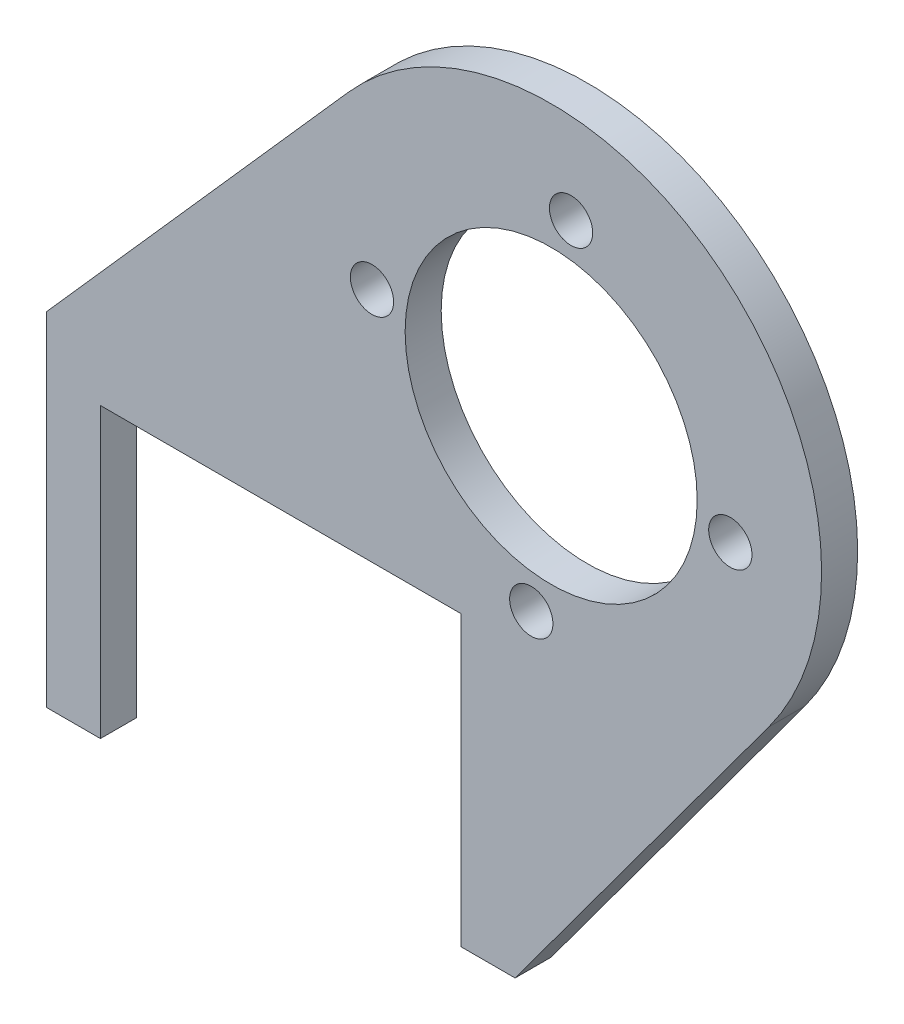
ISO-10303-21;
HEADER;
FILE_DESCRIPTION(('STEP AP214'),'2;1');
FILE_NAME('part.step','',(''),(''),'','','');
FILE_SCHEMA(('AUTOMOTIVE_DESIGN { 1 0 10303 214 1 1 1 1 }'));
ENDSEC;
DATA;
#1=APPLICATION_CONTEXT('core data for automotive mechanical design processes');
#2=APPLICATION_PROTOCOL_DEFINITION('international standard','automotive_design',2000,#1);
#3=PRODUCT_CONTEXT('',#1,'mechanical');
#4=PRODUCT('Part','Part','',(#3));
#5=PRODUCT_RELATED_PRODUCT_CATEGORY('part','',(#4));
#6=PRODUCT_DEFINITION_FORMATION('','',#4);
#7=PRODUCT_DEFINITION_CONTEXT('part definition',#1,'design');
#8=PRODUCT_DEFINITION('design','',#6,#7);
#9=PRODUCT_DEFINITION_SHAPE('','',#8);
#10=(LENGTH_UNIT() NAMED_UNIT(*) SI_UNIT(.MILLI.,.METRE.));
#11=(NAMED_UNIT(*) PLANE_ANGLE_UNIT() SI_UNIT($,.RADIAN.));
#12=(NAMED_UNIT(*) SI_UNIT($,.STERADIAN.) SOLID_ANGLE_UNIT());
#13=UNCERTAINTY_MEASURE_WITH_UNIT(LENGTH_MEASURE(1.E-05),#10,'distance_accuracy_value','');
#14=(GEOMETRIC_REPRESENTATION_CONTEXT(3) GLOBAL_UNCERTAINTY_ASSIGNED_CONTEXT((#13)) GLOBAL_UNIT_ASSIGNED_CONTEXT((#10,
#11,#12)) REPRESENTATION_CONTEXT('',''));
#15=CARTESIAN_POINT('',(0.,0.,0.));
#16=DIRECTION('',(0.,0.,1.));
#17=DIRECTION('',(1.,0.,0.));
#18=AXIS2_PLACEMENT_3D('',#15,#16,#17);
#19=CARTESIAN_POINT('',(0.,0.,10.));
#20=DIRECTION('',(0.,0.,-1.));
#21=DIRECTION('',(-1.,0.,0.));
#22=AXIS2_PLACEMENT_3D('',#19,#20,#21);
#23=PLANE('',#22);
#24=CARTESIAN_POINT('',(49.68668234486,-5.52074248276229,10.));
#25=DIRECTION('',(0.,0.,1.));
#26=DIRECTION('',(1.,0.,0.));
#27=AXIS2_PLACEMENT_3D('',#24,#25,#26);
#28=CIRCLE('',#27,5.99999999999999);
#29=CARTESIAN_POINT('',(55.68668234486,-5.52074248276229,10.));
#30=VERTEX_POINT('',#29);
#31=EDGE_CURVE('E212',#30,#30,#28,.T.);
#32=ORIENTED_EDGE('',*,*,#31,.F.);
#33=EDGE_LOOP('',(#32));
#34=FACE_BOUND('',#33,.T.);
#35=CARTESIAN_POINT('',(-49.68668234486,5.52074248276231,10.));
#36=DIRECTION('',(0.,0.,1.));
#37=DIRECTION('',(1.,0.,0.));
#38=AXIS2_PLACEMENT_3D('',#35,#36,#37);
#39=CIRCLE('',#38,5.99999999999999);
#40=CARTESIAN_POINT('',(-43.68668234486,5.52074248276231,10.));
#41=VERTEX_POINT('',#40);
#42=EDGE_CURVE('E200',#41,#41,#39,.T.);
#43=ORIENTED_EDGE('',*,*,#42,.F.);
#44=EDGE_LOOP('',(#43));
#45=FACE_BOUND('',#44,.T.);
#46=CARTESIAN_POINT('',(0.,0.,10.));
#47=DIRECTION('',(0.,0.,1.));
#48=DIRECTION('',(-1.,0.,0.));
#49=AXIS2_PLACEMENT_3D('',#46,#47,#48);
#50=CIRCLE('',#49,75.);
#51=CARTESIAN_POINT('',(60.3781778862432,-44.491298420446,10.));
#52=VERTEX_POINT('',#51);
#53=CARTESIAN_POINT('',(-56.1575715201263,49.7124447292818,10.));
#54=VERTEX_POINT('',#53);
#55=EDGE_CURVE('E155',#52,#54,#50,.T.);
#56=ORIENTED_EDGE('',*,*,#55,.T.);
#57=DIRECTION('',(-0.662832596390424,-0.748767620268351,0.));
#58=VECTOR('',#57,1.);
#59=CARTESIAN_POINT('',(-56.1575715201263,49.7124447292818,10.));
#60=LINE('',#59,#58);
#61=CARTESIAN_POINT('',(-140.,-45.0000000000001,10.));
#62=VERTEX_POINT('',#61);
#63=EDGE_CURVE('E98',#54,#62,#60,.T.);
#64=ORIENTED_EDGE('',*,*,#63,.T.);
#65=DIRECTION('',(0.,-1.,0.));
#66=VECTOR('',#65,1.);
#67=CARTESIAN_POINT('',(-140.,-45.0000000000001,10.));
#68=LINE('',#67,#66);
#69=CARTESIAN_POINT('',(-140.,-140.,10.));
#70=VERTEX_POINT('',#69);
#71=EDGE_CURVE('E173',#62,#70,#68,.T.);
#72=ORIENTED_EDGE('',*,*,#71,.T.);
#73=DIRECTION('',(1.,0.,0.));
#74=VECTOR('',#73,1.);
#75=CARTESIAN_POINT('',(-140.,-140.,10.));
#76=LINE('',#75,#74);
#77=CARTESIAN_POINT('',(-125.,-140.,10.));
#78=VERTEX_POINT('',#77);
#79=EDGE_CURVE('E190',#70,#78,#76,.T.);
#80=ORIENTED_EDGE('',*,*,#79,.T.);
#81=DIRECTION('',(0.,1.,0.));
#82=VECTOR('',#81,1.);
#83=CARTESIAN_POINT('',(-125.,-140.,10.));
#84=LINE('',#83,#82);
#85=CARTESIAN_POINT('',(-125.,-60.,10.));
#86=VERTEX_POINT('',#85);
#87=EDGE_CURVE('E189',#78,#86,#84,.T.);
#88=ORIENTED_EDGE('',*,*,#87,.T.);
#89=DIRECTION('',(1.,0.,0.));
#90=VECTOR('',#89,1.);
#91=CARTESIAN_POINT('',(-125.,-60.,10.));
#92=LINE('',#91,#90);
#93=CARTESIAN_POINT('',(-25.,-60.,10.));
#94=VERTEX_POINT('',#93);
#95=EDGE_CURVE('E120',#86,#94,#92,.T.);
#96=ORIENTED_EDGE('',*,*,#95,.T.);
#97=DIRECTION('',(0.,-1.,0.));
#98=VECTOR('',#97,1.);
#99=CARTESIAN_POINT('',(-25.,-60.,10.));
#100=LINE('',#99,#98);
#101=CARTESIAN_POINT('',(-25.,-140.,10.));
#102=VERTEX_POINT('',#101);
#103=EDGE_CURVE('E114',#94,#102,#100,.T.);
#104=ORIENTED_EDGE('',*,*,#103,.T.);
#105=DIRECTION('',(1.,0.,0.));
#106=VECTOR('',#105,1.);
#107=CARTESIAN_POINT('',(-25.,-140.,10.));
#108=LINE('',#107,#106);
#109=CARTESIAN_POINT('',(-9.99999999999995,-140.,10.));
#110=VERTEX_POINT('',#109);
#111=EDGE_CURVE('E118',#102,#110,#108,.T.);
#112=ORIENTED_EDGE('',*,*,#111,.T.);
#113=DIRECTION('',(0.593217312272613,0.805042371816575,0.));
#114=VECTOR('',#113,1.);
#115=CARTESIAN_POINT('',(-9.99999999999995,-140.,10.));
#116=LINE('',#115,#114);
#117=EDGE_CURVE('E52',#110,#52,#116,.T.);
#118=ORIENTED_EDGE('',*,*,#117,.T.);
#119=EDGE_LOOP('',(#56,#64,#72,#80,#88,#96,#104,#112,#118));
#120=FACE_BOUND('',#119,.T.);
#121=CARTESIAN_POINT('',(0.,0.,10.));
#122=DIRECTION('',(0.,0.,1.));
#123=DIRECTION('',(1.,0.,0.));
#124=AXIS2_PLACEMENT_3D('',#121,#122,#123);
#125=CIRCLE('',#124,40.5);
#126=CARTESIAN_POINT('',(40.5,0.,10.));
#127=VERTEX_POINT('',#126);
#128=EDGE_CURVE('E142',#127,#127,#125,.T.);
#129=ORIENTED_EDGE('',*,*,#128,.F.);
#130=EDGE_LOOP('',(#129));
#131=FACE_BOUND('',#130,.T.);
#132=CARTESIAN_POINT('',(5.52074248276232,49.68668234486,10.));
#133=DIRECTION('',(0.,0.,1.));
#134=DIRECTION('',(1.,0.,0.));
#135=AXIS2_PLACEMENT_3D('',#132,#133,#134);
#136=CIRCLE('',#135,6.);
#137=CARTESIAN_POINT('',(11.5207424827623,49.68668234486,10.));
#138=VERTEX_POINT('',#137);
#139=EDGE_CURVE('E206',#138,#138,#136,.T.);
#140=ORIENTED_EDGE('',*,*,#139,.F.);
#141=EDGE_LOOP('',(#140));
#142=FACE_BOUND('',#141,.T.);
#143=CARTESIAN_POINT('',(-5.52074248276231,-49.68668234486,10.));
#144=DIRECTION('',(0.,0.,1.));
#145=DIRECTION('',(1.,0.,0.));
#146=AXIS2_PLACEMENT_3D('',#143,#144,#145);
#147=CIRCLE('',#146,5.99999999999999);
#148=CARTESIAN_POINT('',(0.479257517237678,-49.68668234486,10.));
#149=VERTEX_POINT('',#148);
#150=EDGE_CURVE('E218',#149,#149,#147,.T.);
#151=ORIENTED_EDGE('',*,*,#150,.F.);
#152=EDGE_LOOP('',(#151));
#153=FACE_BOUND('',#152,.T.);
#154=ADVANCED_FACE('F35',(#34,#45,#120,#131,#142,#153),#23,.F.);
#155=CARTESIAN_POINT('',(0.,0.,0.));
#156=DIRECTION('',(0.,0.,-1.));
#157=DIRECTION('',(-1.,0.,0.));
#158=AXIS2_PLACEMENT_3D('',#155,#156,#157);
#159=PLANE('',#158);
#160=CARTESIAN_POINT('',(49.68668234486,-5.52074248276229,0.));
#161=DIRECTION('',(0.,0.,1.));
#162=DIRECTION('',(1.,0.,0.));
#163=AXIS2_PLACEMENT_3D('',#160,#161,#162);
#164=CIRCLE('',#163,5.99999999999999);
#165=CARTESIAN_POINT('',(55.68668234486,-5.52074248276229,0.));
#166=VERTEX_POINT('',#165);
#167=EDGE_CURVE('E215',#166,#166,#164,.T.);
#168=ORIENTED_EDGE('',*,*,#167,.T.);
#169=EDGE_LOOP('',(#168));
#170=FACE_BOUND('',#169,.T.);
#171=CARTESIAN_POINT('',(-49.68668234486,5.52074248276231,0.));
#172=DIRECTION('',(0.,0.,1.));
#173=DIRECTION('',(1.,0.,0.));
#174=AXIS2_PLACEMENT_3D('',#171,#172,#173);
#175=CIRCLE('',#174,5.99999999999999);
#176=CARTESIAN_POINT('',(-43.68668234486,5.52074248276231,0.));
#177=VERTEX_POINT('',#176);
#178=EDGE_CURVE('E203',#177,#177,#175,.T.);
#179=ORIENTED_EDGE('',*,*,#178,.T.);
#180=EDGE_LOOP('',(#179));
#181=FACE_BOUND('',#180,.T.);
#182=CARTESIAN_POINT('',(0.,0.,0.));
#183=DIRECTION('',(0.,0.,1.));
#184=DIRECTION('',(-1.,0.,0.));
#185=AXIS2_PLACEMENT_3D('',#182,#183,#184);
#186=CIRCLE('',#185,75.);
#187=CARTESIAN_POINT('',(60.3781778862432,-44.491298420446,0.));
#188=VERTEX_POINT('',#187);
#189=CARTESIAN_POINT('',(-56.1575715201263,49.7124447292818,0.));
#190=VERTEX_POINT('',#189);
#191=EDGE_CURVE('E138',#188,#190,#186,.T.);
#192=ORIENTED_EDGE('',*,*,#191,.F.);
#193=DIRECTION('',(0.593217312272613,0.805042371816575,0.));
#194=VECTOR('',#193,1.);
#195=CARTESIAN_POINT('',(-9.99999999999995,-140.,0.));
#196=LINE('',#195,#194);
#197=CARTESIAN_POINT('',(-9.99999999999995,-140.,0.));
#198=VERTEX_POINT('',#197);
#199=EDGE_CURVE('E90',#198,#188,#196,.T.);
#200=ORIENTED_EDGE('',*,*,#199,.F.);
#201=DIRECTION('',(1.,0.,0.));
#202=VECTOR('',#201,1.);
#203=CARTESIAN_POINT('',(-25.,-140.,0.));
#204=LINE('',#203,#202);
#205=CARTESIAN_POINT('',(-25.,-140.,0.));
#206=VERTEX_POINT('',#205);
#207=EDGE_CURVE('E84',#206,#198,#204,.T.);
#208=ORIENTED_EDGE('',*,*,#207,.F.);
#209=DIRECTION('',(0.,-1.,0.));
#210=VECTOR('',#209,1.);
#211=CARTESIAN_POINT('',(-25.,-60.,0.));
#212=LINE('',#211,#210);
#213=CARTESIAN_POINT('',(-25.,-60.,0.));
#214=VERTEX_POINT('',#213);
#215=EDGE_CURVE('E128',#214,#206,#212,.T.);
#216=ORIENTED_EDGE('',*,*,#215,.F.);
#217=DIRECTION('',(1.,0.,0.));
#218=VECTOR('',#217,1.);
#219=CARTESIAN_POINT('',(-125.,-60.,0.));
#220=LINE('',#219,#218);
#221=CARTESIAN_POINT('',(-125.,-60.,0.));
#222=VERTEX_POINT('',#221);
#223=EDGE_CURVE('E150',#222,#214,#220,.T.);
#224=ORIENTED_EDGE('',*,*,#223,.F.);
#225=DIRECTION('',(0.,1.,0.));
#226=VECTOR('',#225,1.);
#227=CARTESIAN_POINT('',(-125.,-140.,0.));
#228=LINE('',#227,#226);
#229=CARTESIAN_POINT('',(-125.,-140.,0.));
#230=VERTEX_POINT('',#229);
#231=EDGE_CURVE('E148',#230,#222,#228,.T.);
#232=ORIENTED_EDGE('',*,*,#231,.F.);
#233=DIRECTION('',(1.,0.,0.));
#234=VECTOR('',#233,1.);
#235=CARTESIAN_POINT('',(-140.,-140.,0.));
#236=LINE('',#235,#234);
#237=CARTESIAN_POINT('',(-140.,-140.,0.));
#238=VERTEX_POINT('',#237);
#239=EDGE_CURVE('E146',#238,#230,#236,.T.);
#240=ORIENTED_EDGE('',*,*,#239,.F.);
#241=DIRECTION('',(0.,-1.,0.));
#242=VECTOR('',#241,1.);
#243=CARTESIAN_POINT('',(-140.,-45.0000000000001,0.));
#244=LINE('',#243,#242);
#245=CARTESIAN_POINT('',(-140.,-45.0000000000001,0.));
#246=VERTEX_POINT('',#245);
#247=EDGE_CURVE('E144',#246,#238,#244,.T.);
#248=ORIENTED_EDGE('',*,*,#247,.F.);
#249=DIRECTION('',(-0.662832596390424,-0.748767620268351,0.));
#250=VECTOR('',#249,1.);
#251=CARTESIAN_POINT('',(-56.1575715201263,49.7124447292818,0.));
#252=LINE('',#251,#250);
#253=EDGE_CURVE('E141',#190,#246,#252,.T.);
#254=ORIENTED_EDGE('',*,*,#253,.F.);
#255=EDGE_LOOP('',(#192,#200,#208,#216,#224,#232,#240,#248,#254));
#256=FACE_BOUND('',#255,.T.);
#257=CARTESIAN_POINT('',(0.,0.,0.));
#258=DIRECTION('',(0.,0.,1.));
#259=DIRECTION('',(1.,0.,0.));
#260=AXIS2_PLACEMENT_3D('',#257,#258,#259);
#261=CIRCLE('',#260,40.5);
#262=CARTESIAN_POINT('',(40.5,0.,0.));
#263=VERTEX_POINT('',#262);
#264=EDGE_CURVE('E197',#263,#263,#261,.T.);
#265=ORIENTED_EDGE('',*,*,#264,.T.);
#266=EDGE_LOOP('',(#265));
#267=FACE_BOUND('',#266,.T.);
#268=CARTESIAN_POINT('',(5.52074248276232,49.68668234486,0.));
#269=DIRECTION('',(0.,0.,1.));
#270=DIRECTION('',(1.,0.,0.));
#271=AXIS2_PLACEMENT_3D('',#268,#269,#270);
#272=CIRCLE('',#271,6.);
#273=CARTESIAN_POINT('',(11.5207424827623,49.68668234486,0.));
#274=VERTEX_POINT('',#273);
#275=EDGE_CURVE('E209',#274,#274,#272,.T.);
#276=ORIENTED_EDGE('',*,*,#275,.T.);
#277=EDGE_LOOP('',(#276));
#278=FACE_BOUND('',#277,.T.);
#279=CARTESIAN_POINT('',(-5.52074248276231,-49.68668234486,0.));
#280=DIRECTION('',(0.,0.,1.));
#281=DIRECTION('',(1.,0.,0.));
#282=AXIS2_PLACEMENT_3D('',#279,#280,#281);
#283=CIRCLE('',#282,5.99999999999999);
#284=CARTESIAN_POINT('',(0.479257517237678,-49.68668234486,0.));
#285=VERTEX_POINT('',#284);
#286=EDGE_CURVE('E221',#285,#285,#283,.T.);
#287=ORIENTED_EDGE('',*,*,#286,.T.);
#288=EDGE_LOOP('',(#287));
#289=FACE_BOUND('',#288,.T.);
#290=ADVANCED_FACE('F177',(#170,#181,#256,#267,#278,#289),#159,.T.);
#291=CARTESIAN_POINT('',(0.,0.,10.));
#292=DIRECTION('',(0.,0.,-1.));
#293=DIRECTION('',(-1.,0.,0.));
#294=AXIS2_PLACEMENT_3D('',#291,#292,#293);
#295=CYLINDRICAL_SURFACE('',#294,75.);
#296=ORIENTED_EDGE('',*,*,#191,.T.);
#297=DIRECTION('',(0.,0.,-1.));
#298=VECTOR('',#297,1.);
#299=CARTESIAN_POINT('',(-56.1575715201263,49.7124447292818,10.));
#300=LINE('',#299,#298);
#301=EDGE_CURVE('E11',#54,#190,#300,.T.);
#302=ORIENTED_EDGE('',*,*,#301,.F.);
#303=ORIENTED_EDGE('',*,*,#55,.F.);
#304=DIRECTION('',(0.,0.,-1.));
#305=VECTOR('',#304,1.);
#306=CARTESIAN_POINT('',(60.3781778862432,-44.491298420446,10.));
#307=LINE('',#306,#305);
#308=EDGE_CURVE('E134',#52,#188,#307,.T.);
#309=ORIENTED_EDGE('',*,*,#308,.T.);
#310=EDGE_LOOP('',(#296,#302,#303,#309));
#311=FACE_BOUND('',#310,.T.);
#312=ADVANCED_FACE('F37',(#311),#295,.T.);
#313=CARTESIAN_POINT('',(-56.1575715201263,49.7124447292818,10.));
#314=DIRECTION('',(0.748767620268351,-0.662832596390424,0.));
#315=DIRECTION('',(0.662832596390424,0.748767620268351,0.));
#316=AXIS2_PLACEMENT_3D('',#313,#314,#315);
#317=PLANE('',#316);
#318=ORIENTED_EDGE('',*,*,#253,.T.);
#319=DIRECTION('',(0.,0.,-1.));
#320=VECTOR('',#319,1.);
#321=CARTESIAN_POINT('',(-140.,-45.0000000000001,10.));
#322=LINE('',#321,#320);
#323=EDGE_CURVE('E44',#62,#246,#322,.T.);
#324=ORIENTED_EDGE('',*,*,#323,.F.);
#325=ORIENTED_EDGE('',*,*,#63,.F.);
#326=ORIENTED_EDGE('',*,*,#301,.T.);
#327=EDGE_LOOP('',(#318,#324,#325,#326));
#328=FACE_BOUND('',#327,.T.);
#329=ADVANCED_FACE('F260',(#328),#317,.F.);
#330=CARTESIAN_POINT('',(-140.,-45.0000000000001,10.));
#331=DIRECTION('',(1.,0.,0.));
#332=DIRECTION('',(0.,1.,0.));
#333=AXIS2_PLACEMENT_3D('',#330,#331,#332);
#334=PLANE('',#333);
#335=ORIENTED_EDGE('',*,*,#247,.T.);
#336=DIRECTION('',(0.,0.,-1.));
#337=VECTOR('',#336,1.);
#338=CARTESIAN_POINT('',(-140.,-140.,10.));
#339=LINE('',#338,#337);
#340=EDGE_CURVE('E165',#70,#238,#339,.T.);
#341=ORIENTED_EDGE('',*,*,#340,.F.);
#342=ORIENTED_EDGE('',*,*,#71,.F.);
#343=ORIENTED_EDGE('',*,*,#323,.T.);
#344=EDGE_LOOP('',(#335,#341,#342,#343));
#345=FACE_BOUND('',#344,.T.);
#346=ADVANCED_FACE('F171',(#345),#334,.F.);
#347=CARTESIAN_POINT('',(-140.,-140.,10.));
#348=DIRECTION('',(0.,1.,0.));
#349=DIRECTION('',(0.,0.,1.));
#350=AXIS2_PLACEMENT_3D('',#347,#348,#349);
#351=PLANE('',#350);
#352=ORIENTED_EDGE('',*,*,#239,.T.);
#353=DIRECTION('',(0.,0.,-1.));
#354=VECTOR('',#353,1.);
#355=CARTESIAN_POINT('',(-125.,-140.,10.));
#356=LINE('',#355,#354);
#357=EDGE_CURVE('E162',#78,#230,#356,.T.);
#358=ORIENTED_EDGE('',*,*,#357,.F.);
#359=ORIENTED_EDGE('',*,*,#79,.F.);
#360=ORIENTED_EDGE('',*,*,#340,.T.);
#361=EDGE_LOOP('',(#352,#358,#359,#360));
#362=FACE_BOUND('',#361,.T.);
#363=ADVANCED_FACE('F183',(#362),#351,.F.);
#364=CARTESIAN_POINT('',(-125.,-140.,10.));
#365=DIRECTION('',(-1.,0.,0.));
#366=DIRECTION('',(0.,0.,1.));
#367=AXIS2_PLACEMENT_3D('',#364,#365,#366);
#368=PLANE('',#367);
#369=ORIENTED_EDGE('',*,*,#231,.T.);
#370=DIRECTION('',(0.,0.,-1.));
#371=VECTOR('',#370,1.);
#372=CARTESIAN_POINT('',(-125.,-60.,10.));
#373=LINE('',#372,#371);
#374=EDGE_CURVE('E159',#86,#222,#373,.T.);
#375=ORIENTED_EDGE('',*,*,#374,.F.);
#376=ORIENTED_EDGE('',*,*,#87,.F.);
#377=ORIENTED_EDGE('',*,*,#357,.T.);
#378=EDGE_LOOP('',(#369,#375,#376,#377));
#379=FACE_BOUND('',#378,.T.);
#380=ADVANCED_FACE('F187',(#379),#368,.F.);
#381=CARTESIAN_POINT('',(-125.,-60.,10.));
#382=DIRECTION('',(0.,1.,0.));
#383=DIRECTION('',(-1.,0.,0.));
#384=AXIS2_PLACEMENT_3D('',#381,#382,#383);
#385=PLANE('',#384);
#386=ORIENTED_EDGE('',*,*,#223,.T.);
#387=DIRECTION('',(0.,0.,-1.));
#388=VECTOR('',#387,1.);
#389=CARTESIAN_POINT('',(-25.,-60.,10.));
#390=LINE('',#389,#388);
#391=EDGE_CURVE('E129',#94,#214,#390,.T.);
#392=ORIENTED_EDGE('',*,*,#391,.F.);
#393=ORIENTED_EDGE('',*,*,#95,.F.);
#394=ORIENTED_EDGE('',*,*,#374,.T.);
#395=EDGE_LOOP('',(#386,#392,#393,#394));
#396=FACE_BOUND('',#395,.T.);
#397=ADVANCED_FACE('F251',(#396),#385,.F.);
#398=CARTESIAN_POINT('',(-25.,-60.,10.));
#399=DIRECTION('',(1.,0.,0.));
#400=DIRECTION('',(0.,1.,0.));
#401=AXIS2_PLACEMENT_3D('',#398,#399,#400);
#402=PLANE('',#401);
#403=ORIENTED_EDGE('',*,*,#215,.T.);
#404=DIRECTION('',(0.,0.,-1.));
#405=VECTOR('',#404,1.);
#406=CARTESIAN_POINT('',(-25.,-140.,10.));
#407=LINE('',#406,#405);
#408=EDGE_CURVE('E125',#102,#206,#407,.T.);
#409=ORIENTED_EDGE('',*,*,#408,.F.);
#410=ORIENTED_EDGE('',*,*,#103,.F.);
#411=ORIENTED_EDGE('',*,*,#391,.T.);
#412=EDGE_LOOP('',(#403,#409,#410,#411));
#413=FACE_BOUND('',#412,.T.);
#414=ADVANCED_FACE('F126',(#413),#402,.F.);
#415=CARTESIAN_POINT('',(-25.,-140.,10.));
#416=DIRECTION('',(0.,1.,0.));
#417=DIRECTION('',(0.,0.,1.));
#418=AXIS2_PLACEMENT_3D('',#415,#416,#417);
#419=PLANE('',#418);
#420=ORIENTED_EDGE('',*,*,#207,.T.);
#421=DIRECTION('',(0.,0.,-1.));
#422=VECTOR('',#421,1.);
#423=CARTESIAN_POINT('',(-9.99999999999995,-140.,10.));
#424=LINE('',#423,#422);
#425=EDGE_CURVE('E130',#110,#198,#424,.T.);
#426=ORIENTED_EDGE('',*,*,#425,.F.);
#427=ORIENTED_EDGE('',*,*,#111,.F.);
#428=ORIENTED_EDGE('',*,*,#408,.T.);
#429=EDGE_LOOP('',(#420,#426,#427,#428));
#430=FACE_BOUND('',#429,.T.);
#431=ADVANCED_FACE('F132',(#430),#419,.F.);
#432=CARTESIAN_POINT('',(-9.99999999999995,-140.,10.));
#433=DIRECTION('',(-0.805042371816576,0.593217312272613,0.));
#434=DIRECTION('',(-0.593217312272613,-0.805042371816576,0.));
#435=AXIS2_PLACEMENT_3D('',#432,#433,#434);
#436=PLANE('',#435);
#437=ORIENTED_EDGE('',*,*,#199,.T.);
#438=ORIENTED_EDGE('',*,*,#308,.F.);
#439=ORIENTED_EDGE('',*,*,#117,.F.);
#440=ORIENTED_EDGE('',*,*,#425,.T.);
#441=EDGE_LOOP('',(#437,#438,#439,#440));
#442=FACE_BOUND('',#441,.T.);
#443=ADVANCED_FACE('F244',(#442),#436,.F.);
#444=CARTESIAN_POINT('',(0.,0.,10.));
#445=DIRECTION('',(0.,0.,-1.));
#446=DIRECTION('',(-1.,0.,0.));
#447=AXIS2_PLACEMENT_3D('',#444,#445,#446);
#448=CYLINDRICAL_SURFACE('',#447,40.5);
#449=ORIENTED_EDGE('',*,*,#128,.T.);
#450=EDGE_LOOP('',(#449));
#451=FACE_BOUND('',#450,.T.);
#452=ORIENTED_EDGE('',*,*,#264,.F.);
#453=EDGE_LOOP('',(#452));
#454=FACE_BOUND('',#453,.T.);
#455=ADVANCED_FACE('F241',(#451,#454),#448,.F.);
#456=CARTESIAN_POINT('',(-49.68668234486,5.52074248276231,10.));
#457=DIRECTION('',(0.,0.,-1.));
#458=DIRECTION('',(-1.,0.,0.));
#459=AXIS2_PLACEMENT_3D('',#456,#457,#458);
#460=CYLINDRICAL_SURFACE('',#459,5.99999999999999);
#461=ORIENTED_EDGE('',*,*,#42,.T.);
#462=EDGE_LOOP('',(#461));
#463=FACE_BOUND('',#462,.T.);
#464=ORIENTED_EDGE('',*,*,#178,.F.);
#465=EDGE_LOOP('',(#464));
#466=FACE_BOUND('',#465,.T.);
#467=ADVANCED_FACE('F329',(#463,#466),#460,.F.);
#468=CARTESIAN_POINT('',(5.52074248276232,49.68668234486,10.));
#469=DIRECTION('',(0.,0.,-1.));
#470=DIRECTION('',(-1.,0.,0.));
#471=AXIS2_PLACEMENT_3D('',#468,#469,#470);
#472=CYLINDRICAL_SURFACE('',#471,6.);
#473=ORIENTED_EDGE('',*,*,#139,.T.);
#474=EDGE_LOOP('',(#473));
#475=FACE_BOUND('',#474,.T.);
#476=ORIENTED_EDGE('',*,*,#275,.F.);
#477=EDGE_LOOP('',(#476));
#478=FACE_BOUND('',#477,.T.);
#479=ADVANCED_FACE('F337',(#475,#478),#472,.F.);
#480=CARTESIAN_POINT('',(49.68668234486,-5.52074248276229,10.));
#481=DIRECTION('',(0.,0.,-1.));
#482=DIRECTION('',(-1.,0.,0.));
#483=AXIS2_PLACEMENT_3D('',#480,#481,#482);
#484=CYLINDRICAL_SURFACE('',#483,5.99999999999999);
#485=ORIENTED_EDGE('',*,*,#31,.T.);
#486=EDGE_LOOP('',(#485));
#487=FACE_BOUND('',#486,.T.);
#488=ORIENTED_EDGE('',*,*,#167,.F.);
#489=EDGE_LOOP('',(#488));
#490=FACE_BOUND('',#489,.T.);
#491=ADVANCED_FACE('F345',(#487,#490),#484,.F.);
#492=CARTESIAN_POINT('',(-5.52074248276231,-49.68668234486,10.));
#493=DIRECTION('',(0.,0.,-1.));
#494=DIRECTION('',(-1.,0.,0.));
#495=AXIS2_PLACEMENT_3D('',#492,#493,#494);
#496=CYLINDRICAL_SURFACE('',#495,5.99999999999999);
#497=ORIENTED_EDGE('',*,*,#150,.T.);
#498=EDGE_LOOP('',(#497));
#499=FACE_BOUND('',#498,.T.);
#500=ORIENTED_EDGE('',*,*,#286,.F.);
#501=EDGE_LOOP('',(#500));
#502=FACE_BOUND('',#501,.T.);
#503=ADVANCED_FACE('F227',(#499,#502),#496,.F.);
#504=CLOSED_SHELL('',(#154,#290,#312,#329,#346,#363,#380,#397,#414,#431,#443,#455,#467,#479,
#491,#503));
#505=MANIFOLD_SOLID_BREP('B2',#504);
#506=ADVANCED_BREP_SHAPE_REPRESENTATION('',(#18,#505),#14);
#507=SHAPE_DEFINITION_REPRESENTATION(#9,#506);
ENDSEC;
END-ISO-10303-21;
